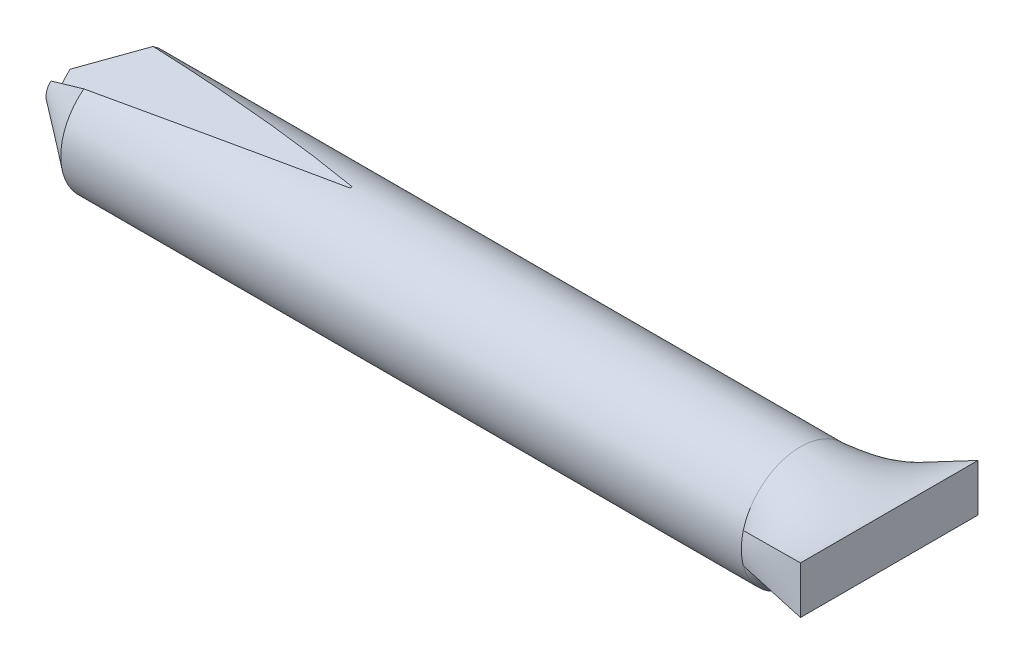
ISO-10303-21;
HEADER;
FILE_DESCRIPTION(('STEP AP214'),'2;1');
FILE_NAME('part.step','',(''),(''),'','','');
FILE_SCHEMA(('AUTOMOTIVE_DESIGN { 1 0 10303 214 1 1 1 1 }'));
ENDSEC;
DATA;
#1=APPLICATION_CONTEXT('core data for automotive mechanical design processes');
#2=APPLICATION_PROTOCOL_DEFINITION('international standard','automotive_design',2000,#1);
#3=PRODUCT_CONTEXT('',#1,'mechanical');
#4=PRODUCT('Part','Part','',(#3));
#5=PRODUCT_RELATED_PRODUCT_CATEGORY('part','',(#4));
#6=PRODUCT_DEFINITION_FORMATION('','',#4);
#7=PRODUCT_DEFINITION_CONTEXT('part definition',#1,'design');
#8=PRODUCT_DEFINITION('design','',#6,#7);
#9=PRODUCT_DEFINITION_SHAPE('','',#8);
#10=(LENGTH_UNIT() NAMED_UNIT(*) SI_UNIT(.MILLI.,.METRE.));
#11=(NAMED_UNIT(*) PLANE_ANGLE_UNIT() SI_UNIT($,.RADIAN.));
#12=(NAMED_UNIT(*) SI_UNIT($,.STERADIAN.) SOLID_ANGLE_UNIT());
#13=UNCERTAINTY_MEASURE_WITH_UNIT(LENGTH_MEASURE(1.E-05),#10,'distance_accuracy_value','');
#14=(GEOMETRIC_REPRESENTATION_CONTEXT(3) GLOBAL_UNCERTAINTY_ASSIGNED_CONTEXT((#13)) GLOBAL_UNIT_ASSIGNED_CONTEXT((#10,
#11,#12)) REPRESENTATION_CONTEXT('',''));
#15=CARTESIAN_POINT('',(0.,0.,0.));
#16=DIRECTION('',(0.,0.,1.));
#17=DIRECTION('',(1.,0.,0.));
#18=AXIS2_PLACEMENT_3D('',#15,#16,#17);
#19=CARTESIAN_POINT('',(0.,0.,0.));
#20=DIRECTION('',(-1.,0.,0.));
#21=DIRECTION('',(0.,0.,1.));
#22=AXIS2_PLACEMENT_3D('',#19,#20,#21);
#23=CYLINDRICAL_SURFACE('',#22,2.);
#24=CARTESIAN_POINT('',(25.,0.515325301120665,-1.93246987920249));
#25=CARTESIAN_POINT('',(25.,0.670926960871702,-1.89097610326888));
#26=CARTESIAN_POINT('',(25.,0.836629144669529,-1.82674994822562));
#27=CARTESIAN_POINT('',(25.,1.16930243614435,-1.6339202893286));
#28=CARTESIAN_POINT('',(25.,1.33624350774333,-1.50474406424802));
#29=CARTESIAN_POINT('',(25.,1.63505197299847,-1.1732035017292));
#30=CARTESIAN_POINT('',(25.,1.76618738027796,-0.970351468728872));
#31=CARTESIAN_POINT('',(25.,1.94918688563023,-0.511537212727044));
#32=CARTESIAN_POINT('',(25.,2.,-0.256092771028001));
#33=CARTESIAN_POINT('',(25.,2.,0.256092771028001));
#34=CARTESIAN_POINT('',(25.,1.94918688563023,0.511537212727044));
#35=CARTESIAN_POINT('',(25.,1.76618738027797,0.970351468728872));
#36=CARTESIAN_POINT('',(25.,1.63505197299847,1.1732035017292));
#37=CARTESIAN_POINT('',(25.,1.33624350774333,1.50474406424802));
#38=CARTESIAN_POINT('',(25.,1.16930243614435,1.6339202893286));
#39=CARTESIAN_POINT('',(25.,0.83662914466953,1.82674994822562));
#40=CARTESIAN_POINT('',(25.,0.670926960871702,1.89097610326888));
#41=CARTESIAN_POINT('',(25.,0.515325301120664,1.93246987920249));
#42=B_SPLINE_CURVE_WITH_KNOTS('',3,(#24,#25,#26,#27,#28,#29,#30,#31,#32,#33,#34,#35,#36,#37,#38,
#39,#40,#41),.UNSPECIFIED.,.F.,.F.,(4,2,2,2,2,2,2,2,4),(0.,0.125,0.25,0.375,0.5,0.625,0.75,
0.875,1.),.UNSPECIFIED.);
#43=CARTESIAN_POINT('',(25.,0.515368467646378,1.93263029658528));
#44=VERTEX_POINT('',#43);
#45=CARTESIAN_POINT('',(25.,0.515362079151203,-1.93260645155761));
#46=VERTEX_POINT('',#45);
#47=EDGE_CURVE('E168',#44,#46,#42,.F.);
#48=ORIENTED_EDGE('',*,*,#47,.T.);
#49=CARTESIAN_POINT('',(25.,0.,0.));
#50=DIRECTION('',(1.,0.,0.));
#51=DIRECTION('',(0.,0.,1.));
#52=AXIS2_PLACEMENT_3D('',#49,#50,#51);
#53=CIRCLE('',#52,2.);
#54=CARTESIAN_POINT('',(25.,-0.515366268415551,-1.93262223989931));
#55=VERTEX_POINT('',#54);
#56=EDGE_CURVE('E174',#55,#46,#53,.T.);
#57=ORIENTED_EDGE('',*,*,#56,.F.);
#58=CARTESIAN_POINT('',(25.,0.,0.));
#59=DIRECTION('',(1.,0.,0.));
#60=DIRECTION('',(0.,0.,1.));
#61=AXIS2_PLACEMENT_3D('',#58,#59,#60);
#62=CIRCLE('',#61,2.);
#63=CARTESIAN_POINT('',(25.,-0.515359898288732,1.93259845062732));
#64=VERTEX_POINT('',#63);
#65=EDGE_CURVE('E71',#64,#55,#62,.T.);
#66=ORIENTED_EDGE('',*,*,#65,.F.);
#67=CARTESIAN_POINT('',(25.,0.,0.));
#68=DIRECTION('',(-1.,0.,0.));
#69=DIRECTION('',(0.,0.,1.));
#70=AXIS2_PLACEMENT_3D('',#67,#68,#69);
#71=CIRCLE('',#70,2.);
#72=EDGE_CURVE('E170',#44,#64,#71,.F.);
#73=ORIENTED_EDGE('',*,*,#72,.F.);
#74=EDGE_LOOP('',(#48,#57,#66,#73));
#75=FACE_BOUND('',#74,.T.);
#76=CARTESIAN_POINT('',(-0.328792128365162,0.,0.));
#77=DIRECTION('',(-0.140466250822454,0.725423352897964,-0.67381762476961));
#78=DIRECTION('',(-0.990085467209717,-0.102917881349982,0.0955964294236328));
#79=AXIS2_PLACEMENT_3D('',#76,#77,#78);
#80=ELLIPSE('',#79,14.2382955926399,2.);
#81=CARTESIAN_POINT('',(2.,1.58450368410336,1.22038849349823));
#82=VERTEX_POINT('',#81);
#83=CARTESIAN_POINT('',(9.81764261235469,1.99964589666915,0.037633601132725));
#84=VERTEX_POINT('',#83);
#85=EDGE_CURVE('E289',#82,#84,#80,.T.);
#86=ORIENTED_EDGE('',*,*,#85,.F.);
#87=CARTESIAN_POINT('',(2.,0.,0.));
#88=DIRECTION('',(-1.,0.,0.));
#89=DIRECTION('',(0.,0.,1.));
#90=AXIS2_PLACEMENT_3D('',#87,#88,#89);
#91=CIRCLE('',#90,2.);
#92=CARTESIAN_POINT('',(2.,1.65687893219431,-1.12015722291589));
#93=VERTEX_POINT('',#92);
#94=EDGE_CURVE('E294',#93,#82,#91,.T.);
#95=ORIENTED_EDGE('',*,*,#94,.F.);
#96=CARTESIAN_POINT('',(-0.328792128365154,0.,0.));
#97=DIRECTION('',(-0.130650635111873,0.674731625754712,0.726407354554775));
#98=DIRECTION('',(-0.99142847021097,-0.0889162638391463,-0.095726101351842));
#99=AXIS2_PLACEMENT_3D('',#96,#97,#98);
#100=ELLIPSE('',#99,15.3080005947728,2.);
#101=CARTESIAN_POINT('',(9.81764261235469,1.99973506671575,-0.0325524645356861));
#102=VERTEX_POINT('',#101);
#103=EDGE_CURVE('E286',#102,#93,#100,.T.);
#104=ORIENTED_EDGE('',*,*,#103,.F.);
#105=CARTESIAN_POINT('',(9.81764261235469,0.,0.));
#106=DIRECTION('',(1.,0.,0.));
#107=DIRECTION('',(0.,0.,-1.));
#108=AXIS2_PLACEMENT_3D('',#105,#106,#107);
#109=CIRCLE('',#108,2.);
#110=EDGE_CURVE('E12',#102,#84,#109,.T.);
#111=ORIENTED_EDGE('',*,*,#110,.T.);
#112=EDGE_LOOP('',(#86,#95,#104,#111));
#113=FACE_BOUND('',#112,.T.);
#114=ADVANCED_FACE('F67',(#75,#113),#23,.T.);
#115=CARTESIAN_POINT('',(2.,0.,0.));
#116=DIRECTION('',(1.,0.,0.));
#117=DIRECTION('',(0.,0.,-1.));
#118=AXIS2_PLACEMENT_3D('',#115,#116,#117);
#119=CONICAL_SURFACE('',#118,2.,0.643501108793284);
#120=CARTESIAN_POINT('',(-0.000199999999998771,0.372854398789606,0.332910828606162));
#121=CARTESIAN_POINT('',(0.0829763145101493,0.423379561878365,0.369966357044782));
#122=CARTESIAN_POINT('',(0.166188029521795,0.473875135953915,0.40698265062827));
#123=CARTESIAN_POINT('',(0.332654506391445,0.574830270171991,0.480967491972073));
#124=CARTESIAN_POINT('',(0.415909268242368,0.625289830320439,0.517936039740241));
#125=CARTESIAN_POINT('',(0.749265527721449,0.827288172737903,0.665912298024041));
#126=CARTESIAN_POINT('',(0.999428474949166,0.978775480222697,0.776851781464966));
#127=CARTESIAN_POINT('',(1.49980160487546,1.28171064589184,0.998678430876929));
#128=CARTESIAN_POINT('',(1.75001178759215,1.43315850406102,1.10956559682785));
#129=CARTESIAN_POINT('',(2.0002,1.58462474617246,1.22047713469685));
#130=B_SPLINE_CURVE_WITH_KNOTS('',3,(#120,#121,#122,#123,#124,#125,#126,#127,#128,#129),
.UNSPECIFIED.,.F.,.F.,(4,2,2,2,4),(0.,0.312406441946581,0.624812832512405,1.56318228342485,
2.50155209482246),.UNSPECIFIED.);
#131=CARTESIAN_POINT('',(0.,0.372975911115708,0.332999954545654));
#132=VERTEX_POINT('',#131);
#133=EDGE_CURVE('E77',#132,#82,#130,.T.);
#134=ORIENTED_EDGE('',*,*,#133,.F.);
#135=CARTESIAN_POINT('',(0.,0.,0.));
#136=DIRECTION('',(-1.,0.,0.));
#137=DIRECTION('',(0.,0.,1.));
#138=AXIS2_PLACEMENT_3D('',#135,#136,#137);
#139=CIRCLE('',#138,0.5);
#140=CARTESIAN_POINT('',(0.,0.394453430316267,-0.307256393443213));
#141=VERTEX_POINT('',#140);
#142=EDGE_CURVE('E292',#141,#132,#139,.T.);
#143=ORIENTED_EDGE('',*,*,#142,.F.);
#144=CARTESIAN_POINT('',(2.0002,1.65700509084694,-1.12023843506966));
#145=CARTESIAN_POINT('',(1.83345600548154,1.55182233739286,-1.05252860098538));
#146=CARTESIAN_POINT('',(1.66671275656804,1.44663889648882,-0.984817994252006));
#147=CARTESIAN_POINT('',(1.33323745582731,1.23626174222035,-0.849385225202453));
#148=CARTESIAN_POINT('',(1.16650540399908,1.13106802885684,-0.781663062887305));
#149=CARTESIAN_POINT('',(0.833062151229354,0.920661399259979,-0.646197151243776));
#150=CARTESIAN_POINT('',(0.666350950290654,0.815448483024063,-0.578453401912505));
#151=CARTESIAN_POINT('',(0.416327701169088,0.657589073008238,-0.476792757086776));
#152=CARTESIAN_POINT('',(0.332993871933561,0.604962593956947,-0.442898370008071));
#153=CARTESIAN_POINT('',(0.166363386900748,0.499675510389443,-0.37507121206563));
#154=CARTESIAN_POINT('',(0.0830667311086336,0.447014905868485,-0.341138441196556));
#155=CARTESIAN_POINT('',(-0.000199999999999255,0.394326854774136,-0.307174794056962));
#156=B_SPLINE_CURVE_WITH_KNOTS('',3,(#144,#145,#146,#147,#148,#149,#150,#151,#152,#153,#154,
#155),.UNSPECIFIED.,.F.,.F.,(4,2,2,2,2,4),(0.,0.625351372931803,1.25070269008849,
1.87605409099697,2.18872982830198,2.50140560909777),.UNSPECIFIED.);
#157=EDGE_CURVE('E297',#93,#141,#156,.T.);
#158=ORIENTED_EDGE('',*,*,#157,.F.);
#159=ORIENTED_EDGE('',*,*,#94,.T.);
#160=EDGE_LOOP('',(#134,#143,#158,#159));
#161=FACE_BOUND('',#160,.T.);
#162=ADVANCED_FACE('F311',(#161),#119,.T.);
#163=CARTESIAN_POINT('',(0.,0.5,0.));
#164=DIRECTION('',(1.,0.,0.));
#165=DIRECTION('',(0.,0.,-1.));
#166=AXIS2_PLACEMENT_3D('',#163,#164,#165);
#167=PLANE('',#166);
#168=ORIENTED_EDGE('',*,*,#142,.T.);
#169=DIRECTION('',(0.,-0.680565109867312,-0.732687608214643));
#170=VECTOR('',#169,1.);
#171=CARTESIAN_POINT('',(0.,-2.75744298842804,-3.03716860532043));
#172=LINE('',#171,#170);
#173=CARTESIAN_POINT('',(0.,0.0636651651575448,0.));
#174=VERTEX_POINT('',#173);
#175=EDGE_CURVE('E93',#132,#174,#172,.T.);
#176=ORIENTED_EDGE('',*,*,#175,.T.);
#177=DIRECTION('',(0.,0.73268760821464,-0.680565109867314));
#178=VECTOR('',#177,1.);
#179=CARTESIAN_POINT('',(0.,-3.20611133221634,3.03716860532043));
#180=LINE('',#179,#178);
#181=EDGE_CURVE('E172',#174,#141,#180,.T.);
#182=ORIENTED_EDGE('',*,*,#181,.T.);
#183=EDGE_LOOP('',(#168,#176,#182));
#184=FACE_BOUND('',#183,.T.);
#185=ADVANCED_FACE('F69',(#184),#167,.F.);
#186=CARTESIAN_POINT('',(9.81764261235469,2.40102433863361,0.));
#187=DIRECTION('',(1.,0.,0.));
#188=DIRECTION('',(0.,0.,-1.));
#189=AXIS2_PLACEMENT_3D('',#186,#187,#188);
#190=PLANE('',#189);
#191=ORIENTED_EDGE('',*,*,#110,.F.);
#192=DIRECTION('',(0.,0.73268760821464,-0.680565109867314));
#193=VECTOR('',#192,1.);
#194=CARTESIAN_POINT('',(9.81764261235469,-2.32561603978963,3.9850984661065));
#195=LINE('',#194,#193);
#196=CARTESIAN_POINT('',(9.81764261235469,1.96468950379115,0.));
#197=VERTEX_POINT('',#196);
#198=EDGE_CURVE('E280',#197,#102,#195,.T.);
#199=ORIENTED_EDGE('',*,*,#198,.F.);
#200=DIRECTION('',(0.,-0.680565109867312,-0.732687608214643));
#201=VECTOR('',#200,1.);
#202=CARTESIAN_POINT('',(9.81764261235469,-1.73691394222114,-3.9850984661065));
#203=LINE('',#202,#201);
#204=EDGE_CURVE('E272',#84,#197,#203,.T.);
#205=ORIENTED_EDGE('',*,*,#204,.F.);
#206=EDGE_LOOP('',(#191,#199,#205));
#207=FACE_BOUND('',#206,.T.);
#208=ADVANCED_FACE('F325',(#207),#190,.F.);
#209=CARTESIAN_POINT('',(-31.4557407188053,-6.02721948580195,0.));
#210=DIRECTION('',(-0.140466250822454,0.725423352897964,-0.67381762476961));
#211=DIRECTION('',(0.,0.680565109867312,0.732687608214643));
#212=AXIS2_PLACEMENT_3D('',#209,#210,#211);
#213=PLANE('',#212);
#214=ORIENTED_EDGE('',*,*,#133,.T.);
#215=ORIENTED_EDGE('',*,*,#85,.T.);
#216=ORIENTED_EDGE('',*,*,#204,.T.);
#217=DIRECTION('',(0.981764261235469,0.190102433863361,0.));
#218=VECTOR('',#217,1.);
#219=CARTESIAN_POINT('',(-31.4557407188053,-6.02721948580195,0.));
#220=LINE('',#219,#218);
#221=EDGE_CURVE('E279',#174,#197,#220,.T.);
#222=ORIENTED_EDGE('',*,*,#221,.F.);
#223=ORIENTED_EDGE('',*,*,#175,.F.);
#224=EDGE_LOOP('',(#214,#215,#216,#222,#223));
#225=FACE_BOUND('',#224,.T.);
#226=ADVANCED_FACE('F318',(#225),#213,.T.);
#227=CARTESIAN_POINT('',(-31.4557407188053,-6.02721948580195,0.));
#228=DIRECTION('',(-0.130650635111873,0.674731625754712,0.726407354554775));
#229=DIRECTION('',(0.,-0.73268760821464,0.680565109867314));
#230=AXIS2_PLACEMENT_3D('',#227,#228,#229);
#231=PLANE('',#230);
#232=ORIENTED_EDGE('',*,*,#198,.T.);
#233=ORIENTED_EDGE('',*,*,#103,.T.);
#234=ORIENTED_EDGE('',*,*,#157,.T.);
#235=ORIENTED_EDGE('',*,*,#181,.F.);
#236=ORIENTED_EDGE('',*,*,#221,.T.);
#237=EDGE_LOOP('',(#232,#233,#234,#235,#236));
#238=FACE_BOUND('',#237,.T.);
#239=ADVANCED_FACE('F314',(#238),#231,.T.);
#240=CARTESIAN_POINT('',(28.,0.,0.));
#241=DIRECTION('',(1.,0.,0.));
#242=DIRECTION('',(0.,0.,-1.));
#243=AXIS2_PLACEMENT_3D('',#240,#241,#242);
#244=PLANE('',#243);
#245=DIRECTION('',(0.,-1.,0.));
#246=VECTOR('',#245,1.);
#247=CARTESIAN_POINT('',(28.,1.6,3.));
#248=LINE('',#247,#246);
#249=CARTESIAN_POINT('',(28.,1.6,3.));
#250=VERTEX_POINT('',#249);
#251=CARTESIAN_POINT('',(28.,0.,3.));
#252=VERTEX_POINT('',#251);
#253=EDGE_CURVE('E142',#250,#252,#248,.T.);
#254=ORIENTED_EDGE('',*,*,#253,.T.);
#255=DIRECTION('',(0.,0.,-1.));
#256=VECTOR('',#255,1.);
#257=CARTESIAN_POINT('',(28.,0.,3.));
#258=LINE('',#257,#256);
#259=CARTESIAN_POINT('',(28.,0.,-3.));
#260=VERTEX_POINT('',#259);
#261=EDGE_CURVE('E162',#252,#260,#258,.T.);
#262=ORIENTED_EDGE('',*,*,#261,.T.);
#263=DIRECTION('',(0.,1.,0.));
#264=VECTOR('',#263,1.);
#265=CARTESIAN_POINT('',(28.,1.6,-3.));
#266=LINE('',#265,#264);
#267=CARTESIAN_POINT('',(28.,1.6,-3.));
#268=VERTEX_POINT('',#267);
#269=EDGE_CURVE('E144',#260,#268,#266,.T.);
#270=ORIENTED_EDGE('',*,*,#269,.T.);
#271=DIRECTION('',(0.,0.,1.));
#272=VECTOR('',#271,1.);
#273=CARTESIAN_POINT('',(28.,1.6,3.));
#274=LINE('',#273,#272);
#275=EDGE_CURVE('E137',#268,#250,#274,.T.);
#276=ORIENTED_EDGE('',*,*,#275,.T.);
#277=EDGE_LOOP('',(#254,#262,#270,#276));
#278=FACE_BOUND('',#277,.T.);
#279=ADVANCED_FACE('F140',(#278),#244,.T.);
#280=CARTESIAN_POINT('',(25.,-0.515325301120665,1.93246987920249));
#281=CARTESIAN_POINT('',(28.,0.,3.));
#282=CARTESIAN_POINT('',(25.,-0.670926960871702,1.89097610326888));
#283=CARTESIAN_POINT('',(28.,0.,2.75));
#284=CARTESIAN_POINT('',(25.,-0.836629144669529,1.82674994822562));
#285=CARTESIAN_POINT('',(28.,0.,2.5));
#286=CARTESIAN_POINT('',(25.,-1.16930243614435,1.6339202893286));
#287=CARTESIAN_POINT('',(28.,0.,2.));
#288=CARTESIAN_POINT('',(25.,-1.33624350774333,1.50474406424802));
#289=CARTESIAN_POINT('',(28.,0.,1.75));
#290=CARTESIAN_POINT('',(25.,-1.63505197299847,1.1732035017292));
#291=CARTESIAN_POINT('',(28.,0.,1.25));
#292=CARTESIAN_POINT('',(25.,-1.76618738027797,0.970351468728872));
#293=CARTESIAN_POINT('',(28.,0.,1.));
#294=CARTESIAN_POINT('',(25.,-1.94918688563023,0.511537212727044));
#295=CARTESIAN_POINT('',(28.,0.,0.5));
#296=CARTESIAN_POINT('',(25.,-2.,0.256092771028));
#297=CARTESIAN_POINT('',(28.,0.,0.25));
#298=CARTESIAN_POINT('',(25.,-2.,-0.256092771028001));
#299=CARTESIAN_POINT('',(28.,0.,-0.25));
#300=CARTESIAN_POINT('',(25.,-1.94918688563023,-0.511537212727044));
#301=CARTESIAN_POINT('',(28.,0.,-0.5));
#302=CARTESIAN_POINT('',(25.,-1.76618738027796,-0.970351468728872));
#303=CARTESIAN_POINT('',(28.,0.,-1.));
#304=CARTESIAN_POINT('',(25.,-1.63505197299847,-1.1732035017292));
#305=CARTESIAN_POINT('',(28.,0.,-1.25));
#306=CARTESIAN_POINT('',(25.,-1.33624350774333,-1.50474406424802));
#307=CARTESIAN_POINT('',(28.,0.,-1.75));
#308=CARTESIAN_POINT('',(25.,-1.16930243614435,-1.6339202893286));
#309=CARTESIAN_POINT('',(28.,0.,-2.));
#310=CARTESIAN_POINT('',(25.,-0.836629144669529,-1.82674994822562));
#311=CARTESIAN_POINT('',(28.,0.,-2.5));
#312=CARTESIAN_POINT('',(25.,-0.670926960871702,-1.89097610326888));
#313=CARTESIAN_POINT('',(28.,0.,-2.75));
#314=CARTESIAN_POINT('',(25.,-0.515325301120664,-1.93246987920249));
#315=CARTESIAN_POINT('',(28.,0.,-3.));
#316=B_SPLINE_SURFACE_WITH_KNOTS('',3,1,((#280,#281),(#282,#283),(#284,#285),(#286,#287),(#288,
#289),(#290,#291),(#292,#293),(#294,#295),(#296,#297),(#298,#299),(#300,#301),(#302,#303),(#304,
#305),(#306,#307),(#308,#309),(#310,#311),(#312,#313),(#314,#315)),.UNSPECIFIED.,.F.,.F.,.F.,(4,
2,2,2,2,2,2,2,4),(2,2),(0.,0.125,0.25,0.375,0.5,0.625,0.75,0.875,1.),(0.,1.),.UNSPECIFIED.);
#317=DIRECTION('',(0.930028892888287,0.159755806426191,-0.330944618790068));
#318=VECTOR('',#317,1.);
#319=CARTESIAN_POINT('',(26.5,-0.257662650560332,-2.46623493960125));
#320=LINE('',#319,#318);
#321=EDGE_CURVE('E85',#55,#260,#320,.T.);
#322=DIRECTION('',(-0.930028892888287,-0.159755806426192,-0.330944618790069));
#323=VECTOR('',#322,1.);
#324=CARTESIAN_POINT('',(26.5,-0.257662650560332,2.46623493960125));
#325=LINE('',#324,#323);
#326=EDGE_CURVE('E150',#252,#64,#325,.T.);
#327=ORIENTED_EDGE('',*,*,#65,.T.);
#328=ORIENTED_EDGE('',*,*,#321,.T.);
#329=ORIENTED_EDGE('',*,*,#261,.F.);
#330=ORIENTED_EDGE('',*,*,#326,.T.);
#331=EDGE_LOOP('',(#327,#328,#329,#330));
#332=FACE_BOUND('',#331,.T.);
#333=ADVANCED_FACE('F190',(#332),#316,.T.);
#334=CARTESIAN_POINT('',(25.,-0.515325301120664,-1.93246987920249));
#335=CARTESIAN_POINT('',(28.,0.,-3.));
#336=CARTESIAN_POINT('',(25.,-0.349350197386224,-1.97672990686501));
#337=CARTESIAN_POINT('',(28.,0.266666666666667,-3.));
#338=CARTESIAN_POINT('',(25.,-0.174724898753341,-2.));
#339=CARTESIAN_POINT('',(28.,0.533333333333333,-3.));
#340=CARTESIAN_POINT('',(25.,0.174724898753341,-2.));
#341=CARTESIAN_POINT('',(28.,1.06666666666667,-3.));
#342=CARTESIAN_POINT('',(25.,0.349350197386225,-1.97672990686501));
#343=CARTESIAN_POINT('',(28.,1.33333333333333,-3.));
#344=CARTESIAN_POINT('',(25.,0.515325301120665,-1.93246987920249));
#345=CARTESIAN_POINT('',(28.,1.6,-3.));
#346=B_SPLINE_SURFACE_WITH_KNOTS('',3,1,((#334,#335),(#336,#337),(#338,#339),(#340,#341),(#342,
#343),(#344,#345)),.UNSPECIFIED.,.F.,.F.,.F.,(4,2,4),(2,2),(0.,0.5,1.),(0.,1.),.UNSPECIFIED.);
#347=DIRECTION('',(0.891809518584815,0.322441073676237,-0.317344507701072));
#348=VECTOR('',#347,1.);
#349=CARTESIAN_POINT('',(26.5,1.05766265056033,-2.46623493960125));
#350=LINE('',#349,#348);
#351=EDGE_CURVE('E247',#46,#268,#350,.T.);
#352=ORIENTED_EDGE('',*,*,#56,.T.);
#353=ORIENTED_EDGE('',*,*,#351,.T.);
#354=ORIENTED_EDGE('',*,*,#269,.F.);
#355=ORIENTED_EDGE('',*,*,#321,.F.);
#356=EDGE_LOOP('',(#352,#353,#354,#355));
#357=FACE_BOUND('',#356,.T.);
#358=ADVANCED_FACE('F202',(#357),#346,.T.);
#359=CARTESIAN_POINT('',(25.,0.515325301120664,1.93246987920249));
#360=CARTESIAN_POINT('',(28.,1.6,3.));
#361=CARTESIAN_POINT('',(25.,0.349350197386225,1.97672990686501));
#362=CARTESIAN_POINT('',(28.,1.33333333333333,3.));
#363=CARTESIAN_POINT('',(25.,0.174724898753341,2.));
#364=CARTESIAN_POINT('',(28.,1.06666666666667,3.));
#365=CARTESIAN_POINT('',(25.,-0.174724898753342,2.));
#366=CARTESIAN_POINT('',(28.,0.533333333333334,3.));
#367=CARTESIAN_POINT('',(25.,-0.349350197386225,1.97672990686501));
#368=CARTESIAN_POINT('',(28.,0.266666666666667,3.));
#369=CARTESIAN_POINT('',(25.,-0.515325301120665,1.93246987920249));
#370=CARTESIAN_POINT('',(28.,0.,3.));
#371=B_SPLINE_SURFACE_WITH_KNOTS('',3,1,((#359,#360),(#361,#362),(#363,#364),(#365,#366),(#367,
#368),(#369,#370)),.UNSPECIFIED.,.F.,.F.,.F.,(4,2,4),(2,2),(0.,0.5,1.),(0.,1.),.UNSPECIFIED.);
#372=DIRECTION('',(0.891809518584815,0.322441073676237,0.317344507701072));
#373=VECTOR('',#372,1.);
#374=CARTESIAN_POINT('',(26.5,1.05766265056033,2.46623493960125));
#375=LINE('',#374,#373);
#376=EDGE_CURVE('E159',#44,#250,#375,.T.);
#377=ORIENTED_EDGE('',*,*,#72,.T.);
#378=ORIENTED_EDGE('',*,*,#326,.F.);
#379=ORIENTED_EDGE('',*,*,#253,.F.);
#380=ORIENTED_EDGE('',*,*,#376,.F.);
#381=EDGE_LOOP('',(#377,#378,#379,#380));
#382=FACE_BOUND('',#381,.T.);
#383=ADVANCED_FACE('F158',(#382),#371,.T.);
#384=CARTESIAN_POINT('',(25.,0.515325301120665,-1.93246987920249));
#385=CARTESIAN_POINT('',(28.,1.6,-3.));
#386=CARTESIAN_POINT('',(25.,0.670926960871702,-1.89097610326888));
#387=CARTESIAN_POINT('',(28.,1.6,-2.75));
#388=CARTESIAN_POINT('',(25.,0.836629144669529,-1.82674994822562));
#389=CARTESIAN_POINT('',(28.,1.6,-2.5));
#390=CARTESIAN_POINT('',(25.,1.16930243614435,-1.6339202893286));
#391=CARTESIAN_POINT('',(28.,1.6,-2.));
#392=CARTESIAN_POINT('',(25.,1.33624350774333,-1.50474406424802));
#393=CARTESIAN_POINT('',(28.,1.6,-1.75));
#394=CARTESIAN_POINT('',(25.,1.63505197299847,-1.1732035017292));
#395=CARTESIAN_POINT('',(28.,1.6,-1.25));
#396=CARTESIAN_POINT('',(25.,1.76618738027796,-0.970351468728872));
#397=CARTESIAN_POINT('',(28.,1.6,-0.999999999999996));
#398=CARTESIAN_POINT('',(25.,1.94918688563023,-0.511537212727044));
#399=CARTESIAN_POINT('',(28.,1.6,-0.499999999999996));
#400=CARTESIAN_POINT('',(25.,2.,-0.256092771028001));
#401=CARTESIAN_POINT('',(28.,1.6,-0.249999999999996));
#402=CARTESIAN_POINT('',(25.,2.,0.256092771028001));
#403=CARTESIAN_POINT('',(28.,1.6,0.250000000000005));
#404=CARTESIAN_POINT('',(25.,1.94918688563023,0.511537212727044));
#405=CARTESIAN_POINT('',(28.,1.6,0.500000000000004));
#406=CARTESIAN_POINT('',(25.,1.76618738027797,0.970351468728872));
#407=CARTESIAN_POINT('',(28.,1.6,1.));
#408=CARTESIAN_POINT('',(25.,1.63505197299847,1.1732035017292));
#409=CARTESIAN_POINT('',(28.,1.6,1.25));
#410=CARTESIAN_POINT('',(25.,1.33624350774333,1.50474406424802));
#411=CARTESIAN_POINT('',(28.,1.6,1.75));
#412=CARTESIAN_POINT('',(25.,1.16930243614435,1.6339202893286));
#413=CARTESIAN_POINT('',(28.,1.6,2.));
#414=CARTESIAN_POINT('',(25.,0.83662914466953,1.82674994822562));
#415=CARTESIAN_POINT('',(28.,1.6,2.5));
#416=CARTESIAN_POINT('',(25.,0.670926960871702,1.89097610326888));
#417=CARTESIAN_POINT('',(28.,1.6,2.75));
#418=CARTESIAN_POINT('',(25.,0.515325301120664,1.93246987920249));
#419=CARTESIAN_POINT('',(28.,1.6,3.));
#420=B_SPLINE_SURFACE_WITH_KNOTS('',3,1,((#384,#385),(#386,#387),(#388,#389),(#390,#391),(#392,
#393),(#394,#395),(#396,#397),(#398,#399),(#400,#401),(#402,#403),(#404,#405),(#406,#407),(#408,
#409),(#410,#411),(#412,#413),(#414,#415),(#416,#417),(#418,#419)),.UNSPECIFIED.,.F.,.F.,.F.,(4,
2,2,2,2,2,2,2,4),(2,2),(0.,0.125,0.25,0.375,0.5,0.625,0.75,0.875,1.),(0.,1.),.UNSPECIFIED.);
#421=ORIENTED_EDGE('',*,*,#47,.F.);
#422=ORIENTED_EDGE('',*,*,#376,.T.);
#423=ORIENTED_EDGE('',*,*,#275,.F.);
#424=ORIENTED_EDGE('',*,*,#351,.F.);
#425=EDGE_LOOP('',(#421,#422,#423,#424));
#426=FACE_BOUND('',#425,.T.);
#427=ADVANCED_FACE('F166',(#426),#420,.T.);
#428=CLOSED_SHELL('',(#114,#162,#185,#208,#226,#239,#279,#333,#358,#383,#427));
#429=MANIFOLD_SOLID_BREP('B2',#428);
#430=ADVANCED_BREP_SHAPE_REPRESENTATION('',(#18,#429),#14);
#431=SHAPE_DEFINITION_REPRESENTATION(#9,#430);
ENDSEC;
END-ISO-10303-21;
